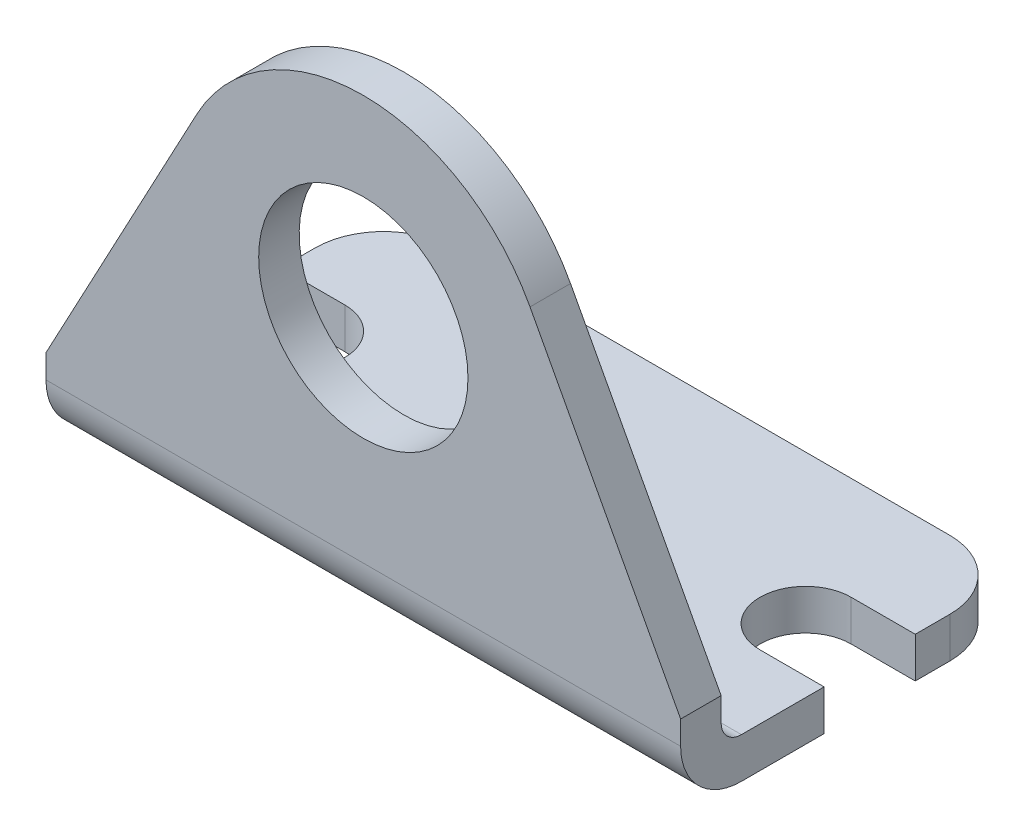
ISO-10303-21;
HEADER;
FILE_DESCRIPTION(('STEP AP214'),'2;1');
FILE_NAME('part.step','',(''),(''),'','','');
FILE_SCHEMA(('AUTOMOTIVE_DESIGN { 1 0 10303 214 1 1 1 1 }'));
ENDSEC;
DATA;
#1=APPLICATION_CONTEXT('core data for automotive mechanical design processes');
#2=APPLICATION_PROTOCOL_DEFINITION('international standard','automotive_design',2000,#1);
#3=PRODUCT_CONTEXT('',#1,'mechanical');
#4=PRODUCT('Part','Part','',(#3));
#5=PRODUCT_RELATED_PRODUCT_CATEGORY('part','',(#4));
#6=PRODUCT_DEFINITION_FORMATION('','',#4);
#7=PRODUCT_DEFINITION_CONTEXT('part definition',#1,'design');
#8=PRODUCT_DEFINITION('design','',#6,#7);
#9=PRODUCT_DEFINITION_SHAPE('','',#8);
#10=(LENGTH_UNIT() NAMED_UNIT(*) SI_UNIT(.MILLI.,.METRE.));
#11=(NAMED_UNIT(*) PLANE_ANGLE_UNIT() SI_UNIT($,.RADIAN.));
#12=(NAMED_UNIT(*) SI_UNIT($,.STERADIAN.) SOLID_ANGLE_UNIT());
#13=UNCERTAINTY_MEASURE_WITH_UNIT(LENGTH_MEASURE(1.E-05),#10,'distance_accuracy_value','');
#14=(GEOMETRIC_REPRESENTATION_CONTEXT(3) GLOBAL_UNCERTAINTY_ASSIGNED_CONTEXT((#13)) GLOBAL_UNIT_ASSIGNED_CONTEXT((#10,
#11,#12)) REPRESENTATION_CONTEXT('',''));
#15=CARTESIAN_POINT('',(0.,0.,0.));
#16=DIRECTION('',(0.,0.,1.));
#17=DIRECTION('',(1.,0.,0.));
#18=AXIS2_PLACEMENT_3D('',#15,#16,#17);
#19=CARTESIAN_POINT('',(-23.876,0.,14.224));
#20=DIRECTION('',(0.,1.,0.));
#21=DIRECTION('',(0.,0.,1.));
#22=AXIS2_PLACEMENT_3D('',#19,#20,#21);
#23=PLANE('',#22);
#24=DIRECTION('',(0.,0.,-1.));
#25=VECTOR('',#24,1.);
#26=CARTESIAN_POINT('',(-23.876,0.,14.224));
#27=LINE('',#26,#25);
#28=CARTESIAN_POINT('',(-23.876,0.,-3.429));
#29=VERTEX_POINT('',#28);
#30=CARTESIAN_POINT('',(-23.876,0.,-6.0325));
#31=VERTEX_POINT('',#30);
#32=EDGE_CURVE('E199',#29,#31,#27,.T.);
#33=ORIENTED_EDGE('',*,*,#32,.T.);
#34=CARTESIAN_POINT('',(-18.7325,0.,-6.0325));
#35=DIRECTION('',(0.,1.,0.));
#36=DIRECTION('',(0.,0.,1.));
#37=AXIS2_PLACEMENT_3D('',#34,#35,#36);
#38=CIRCLE('',#37,5.1435);
#39=CARTESIAN_POINT('',(-18.7325,0.,-11.176));
#40=VERTEX_POINT('',#39);
#41=EDGE_CURVE('E222',#31,#40,#38,.F.);
#42=ORIENTED_EDGE('',*,*,#41,.T.);
#43=DIRECTION('',(1.,0.,0.));
#44=VECTOR('',#43,1.);
#45=CARTESIAN_POINT('',(-23.876,0.,-11.176));
#46=LINE('',#45,#44);
#47=CARTESIAN_POINT('',(18.7325,0.,-11.176));
#48=VERTEX_POINT('',#47);
#49=EDGE_CURVE('E245',#40,#48,#46,.T.);
#50=ORIENTED_EDGE('',*,*,#49,.T.);
#51=CARTESIAN_POINT('',(18.7325,0.,-6.0325));
#52=DIRECTION('',(0.,1.,0.));
#53=DIRECTION('',(0.,0.,1.));
#54=AXIS2_PLACEMENT_3D('',#51,#52,#53);
#55=CIRCLE('',#54,5.1435);
#56=CARTESIAN_POINT('',(23.876,0.,-6.0325));
#57=VERTEX_POINT('',#56);
#58=EDGE_CURVE('E220',#48,#57,#55,.F.);
#59=ORIENTED_EDGE('',*,*,#58,.T.);
#60=DIRECTION('',(0.,0.,-1.));
#61=VECTOR('',#60,1.);
#62=CARTESIAN_POINT('',(23.876,0.,14.224));
#63=LINE('',#62,#61);
#64=CARTESIAN_POINT('',(23.876,0.,-3.429));
#65=VERTEX_POINT('',#64);
#66=EDGE_CURVE('E200',#65,#57,#63,.T.);
#67=ORIENTED_EDGE('',*,*,#66,.F.);
#68=DIRECTION('',(-1.,0.,0.));
#69=VECTOR('',#68,1.);
#70=CARTESIAN_POINT('',(19.05,0.,-3.429));
#71=LINE('',#70,#69);
#72=CARTESIAN_POINT('',(19.05,0.,-3.429));
#73=VERTEX_POINT('',#72);
#74=EDGE_CURVE('E324',#65,#73,#71,.T.);
#75=ORIENTED_EDGE('',*,*,#74,.T.);
#76=CARTESIAN_POINT('',(19.05,0.,0.));
#77=DIRECTION('',(0.,1.,0.));
#78=DIRECTION('',(0.,0.,1.));
#79=AXIS2_PLACEMENT_3D('',#76,#77,#78);
#80=CIRCLE('',#79,3.429);
#81=CARTESIAN_POINT('',(19.05,0.,3.429));
#82=VERTEX_POINT('',#81);
#83=EDGE_CURVE('E321',#73,#82,#80,.T.);
#84=ORIENTED_EDGE('',*,*,#83,.T.);
#85=DIRECTION('',(1.,0.,0.));
#86=VECTOR('',#85,1.);
#87=CARTESIAN_POINT('',(19.05,0.,3.429));
#88=LINE('',#87,#86);
#89=CARTESIAN_POINT('',(23.876,0.,3.429));
#90=VERTEX_POINT('',#89);
#91=EDGE_CURVE('E198',#82,#90,#88,.T.);
#92=ORIENTED_EDGE('',*,*,#91,.T.);
#93=CARTESIAN_POINT('',(23.876,0.,9.652));
#94=VERTEX_POINT('',#93);
#95=EDGE_CURVE('E189',#94,#90,#63,.T.);
#96=ORIENTED_EDGE('',*,*,#95,.F.);
#97=DIRECTION('',(-1.,0.,0.));
#98=VECTOR('',#97,1.);
#99=CARTESIAN_POINT('',(23.876,0.,9.652));
#100=LINE('',#99,#98);
#101=CARTESIAN_POINT('',(-23.876,0.,9.652));
#102=VERTEX_POINT('',#101);
#103=EDGE_CURVE('E172',#94,#102,#100,.T.);
#104=ORIENTED_EDGE('',*,*,#103,.T.);
#105=CARTESIAN_POINT('',(-23.876,0.,3.429));
#106=VERTEX_POINT('',#105);
#107=EDGE_CURVE('E202',#102,#106,#27,.T.);
#108=ORIENTED_EDGE('',*,*,#107,.T.);
#109=DIRECTION('',(1.,0.,0.));
#110=VECTOR('',#109,1.);
#111=CARTESIAN_POINT('',(-19.05,0.,3.429));
#112=LINE('',#111,#110);
#113=CARTESIAN_POINT('',(-19.05,0.,3.429));
#114=VERTEX_POINT('',#113);
#115=EDGE_CURVE('E337',#106,#114,#112,.T.);
#116=ORIENTED_EDGE('',*,*,#115,.T.);
#117=CARTESIAN_POINT('',(-19.05,0.,0.));
#118=DIRECTION('',(0.,1.,0.));
#119=DIRECTION('',(0.,0.,1.));
#120=AXIS2_PLACEMENT_3D('',#117,#118,#119);
#121=CIRCLE('',#120,3.429);
#122=CARTESIAN_POINT('',(-19.05,0.,-3.429));
#123=VERTEX_POINT('',#122);
#124=EDGE_CURVE('E340',#114,#123,#121,.T.);
#125=ORIENTED_EDGE('',*,*,#124,.T.);
#126=DIRECTION('',(-1.,0.,0.));
#127=VECTOR('',#126,1.);
#128=CARTESIAN_POINT('',(-19.05,0.,-3.429));
#129=LINE('',#128,#127);
#130=EDGE_CURVE('E335',#123,#29,#129,.T.);
#131=ORIENTED_EDGE('',*,*,#130,.T.);
#132=EDGE_LOOP('',(#33,#42,#50,#59,#67,#75,#84,#92,#96,#104,#108,#116,#125,#131));
#133=FACE_BOUND('',#132,.T.);
#134=ADVANCED_FACE('F34',(#133),#23,.F.);
#135=CARTESIAN_POINT('',(0.,20.828,14.224));
#136=DIRECTION('',(0.,0.,1.));
#137=DIRECTION('',(1.,0.,0.));
#138=AXIS2_PLACEMENT_3D('',#135,#136,#137);
#139=PLANE('',#138);
#140=CARTESIAN_POINT('',(0.,20.574,14.224));
#141=DIRECTION('',(0.,0.,1.));
#142=DIRECTION('',(1.,0.,0.));
#143=AXIS2_PLACEMENT_3D('',#140,#141,#142);
#144=CIRCLE('',#143,7.874);
#145=CARTESIAN_POINT('',(7.874,20.574,14.224));
#146=VERTEX_POINT('',#145);
#147=EDGE_CURVE('E249',#146,#146,#144,.T.);
#148=ORIENTED_EDGE('',*,*,#147,.F.);
#149=EDGE_LOOP('',(#148));
#150=FACE_BOUND('',#149,.T.);
#151=DIRECTION('',(0.,-1.,0.));
#152=VECTOR('',#151,1.);
#153=CARTESIAN_POINT('',(-23.876,6.35,14.224));
#154=LINE('',#153,#152);
#155=CARTESIAN_POINT('',(-23.876,6.35,14.224));
#156=VERTEX_POINT('',#155);
#157=CARTESIAN_POINT('',(-23.876,4.572,14.224));
#158=VERTEX_POINT('',#157);
#159=EDGE_CURVE('E252',#156,#158,#154,.T.);
#160=ORIENTED_EDGE('',*,*,#159,.T.);
#161=DIRECTION('',(-1.,0.,0.));
#162=VECTOR('',#161,1.);
#163=CARTESIAN_POINT('',(23.876,4.572,14.224));
#164=LINE('',#163,#162);
#165=CARTESIAN_POINT('',(23.876,4.572,14.224));
#166=VERTEX_POINT('',#165);
#167=EDGE_CURVE('E183',#166,#158,#164,.T.);
#168=ORIENTED_EDGE('',*,*,#167,.F.);
#169=DIRECTION('',(0.,1.,0.));
#170=VECTOR('',#169,1.);
#171=CARTESIAN_POINT('',(23.876,0.,14.224));
#172=LINE('',#171,#170);
#173=CARTESIAN_POINT('',(23.876,6.35,14.224));
#174=VERTEX_POINT('',#173);
#175=EDGE_CURVE('E192',#166,#174,#172,.T.);
#176=ORIENTED_EDGE('',*,*,#175,.T.);
#177=DIRECTION('',(-0.471685602568826,0.881766801557693,0.));
#178=VECTOR('',#177,1.);
#179=CARTESIAN_POINT('',(23.876,6.35,14.224));
#180=LINE('',#179,#178);
#181=CARTESIAN_POINT('',(12.5422509853566,27.537256010939,14.224));
#182=VERTEX_POINT('',#181);
#183=EDGE_CURVE('E261',#174,#182,#180,.T.);
#184=ORIENTED_EDGE('',*,*,#183,.T.);
#185=CARTESIAN_POINT('',(0.,20.828,14.224));
#186=DIRECTION('',(0.,0.,1.));
#187=DIRECTION('',(1.,0.,0.));
#188=AXIS2_PLACEMENT_3D('',#185,#186,#187);
#189=CIRCLE('',#188,14.224);
#190=CARTESIAN_POINT('',(-12.5422509853566,27.537256010939,14.224));
#191=VERTEX_POINT('',#190);
#192=EDGE_CURVE('E263',#182,#191,#189,.T.);
#193=ORIENTED_EDGE('',*,*,#192,.T.);
#194=DIRECTION('',(-0.471685602568826,-0.881766801557693,0.));
#195=VECTOR('',#194,1.);
#196=CARTESIAN_POINT('',(-12.5422509853566,27.537256010939,14.224));
#197=LINE('',#196,#195);
#198=EDGE_CURVE('E265',#191,#156,#197,.T.);
#199=ORIENTED_EDGE('',*,*,#198,.T.);
#200=EDGE_LOOP('',(#160,#168,#176,#184,#193,#199));
#201=FACE_BOUND('',#200,.T.);
#202=ADVANCED_FACE('F378',(#150,#201),#139,.T.);
#203=CARTESIAN_POINT('',(23.876,0.,14.224));
#204=DIRECTION('',(-1.,0.,0.));
#205=DIRECTION('',(0.,0.,1.));
#206=AXIS2_PLACEMENT_3D('',#203,#204,#205);
#207=PLANE('',#206);
#208=ORIENTED_EDGE('',*,*,#175,.F.);
#209=CARTESIAN_POINT('',(23.876,4.572,9.652));
#210=DIRECTION('',(1.,0.,0.));
#211=DIRECTION('',(0.,0.,1.));
#212=AXIS2_PLACEMENT_3D('',#209,#210,#211);
#213=CIRCLE('',#212,4.572);
#214=EDGE_CURVE('E175',#166,#94,#213,.T.);
#215=ORIENTED_EDGE('',*,*,#214,.T.);
#216=ORIENTED_EDGE('',*,*,#95,.T.);
#217=DIRECTION('',(0.,-1.,0.));
#218=VECTOR('',#217,1.);
#219=CARTESIAN_POINT('',(23.876,35.052,3.429));
#220=LINE('',#219,#218);
#221=CARTESIAN_POINT('',(23.876,3.048,3.429));
#222=VERTEX_POINT('',#221);
#223=EDGE_CURVE('E331',#222,#90,#220,.T.);
#224=ORIENTED_EDGE('',*,*,#223,.F.);
#225=DIRECTION('',(0.,0.,1.));
#226=VECTOR('',#225,1.);
#227=CARTESIAN_POINT('',(23.876,3.048,-11.176));
#228=LINE('',#227,#226);
#229=CARTESIAN_POINT('',(23.876,3.048,9.652));
#230=VERTEX_POINT('',#229);
#231=EDGE_CURVE('E302',#222,#230,#228,.T.);
#232=ORIENTED_EDGE('',*,*,#231,.T.);
#233=CARTESIAN_POINT('',(23.876,4.572,9.652));
#234=DIRECTION('',(-1.,0.,0.));
#235=DIRECTION('',(0.,0.,1.));
#236=AXIS2_PLACEMENT_3D('',#233,#234,#235);
#237=CIRCLE('',#236,1.524);
#238=CARTESIAN_POINT('',(23.876,4.572,11.176));
#239=VERTEX_POINT('',#238);
#240=EDGE_CURVE('E289',#230,#239,#237,.T.);
#241=ORIENTED_EDGE('',*,*,#240,.T.);
#242=DIRECTION('',(0.,1.,0.));
#243=VECTOR('',#242,1.);
#244=CARTESIAN_POINT('',(23.876,35.052,11.176));
#245=LINE('',#244,#243);
#246=CARTESIAN_POINT('',(23.876,6.34999999999999,11.176));
#247=VERTEX_POINT('',#246);
#248=EDGE_CURVE('E286',#239,#247,#245,.T.);
#249=ORIENTED_EDGE('',*,*,#248,.T.);
#250=DIRECTION('',(0.,0.,-1.));
#251=VECTOR('',#250,1.);
#252=CARTESIAN_POINT('',(23.876,6.35,14.224));
#253=LINE('',#252,#251);
#254=EDGE_CURVE('E205',#174,#247,#253,.T.);
#255=ORIENTED_EDGE('',*,*,#254,.F.);
#256=EDGE_LOOP('',(#208,#215,#216,#224,#232,#241,#249,#255));
#257=FACE_BOUND('',#256,.T.);
#258=ADVANCED_FACE('F187',(#257),#207,.F.);
#259=ORIENTED_EDGE('',*,*,#66,.T.);
#260=DIRECTION('',(0.,1.,0.));
#261=VECTOR('',#260,1.);
#262=CARTESIAN_POINT('',(23.876,0.,-6.0325));
#263=LINE('',#262,#261);
#264=CARTESIAN_POINT('',(23.876,3.048,-6.0325));
#265=VERTEX_POINT('',#264);
#266=EDGE_CURVE('E11',#57,#265,#263,.T.);
#267=ORIENTED_EDGE('',*,*,#266,.T.);
#268=CARTESIAN_POINT('',(23.876,3.048,-3.429));
#269=VERTEX_POINT('',#268);
#270=EDGE_CURVE('E294',#265,#269,#228,.T.);
#271=ORIENTED_EDGE('',*,*,#270,.T.);
#272=DIRECTION('',(0.,-1.,0.));
#273=VECTOR('',#272,1.);
#274=CARTESIAN_POINT('',(23.876,35.052,-3.429));
#275=LINE('',#274,#273);
#276=EDGE_CURVE('E329',#269,#65,#275,.T.);
#277=ORIENTED_EDGE('',*,*,#276,.T.);
#278=EDGE_LOOP('',(#259,#267,#271,#277));
#279=FACE_BOUND('',#278,.T.);
#280=ADVANCED_FACE('F398',(#279),#207,.F.);
#281=CARTESIAN_POINT('',(23.876,6.35,14.224));
#282=DIRECTION('',(-0.881766801557693,-0.471685602568826,0.));
#283=DIRECTION('',(0.471685602568826,-0.881766801557693,0.));
#284=AXIS2_PLACEMENT_3D('',#281,#282,#283);
#285=PLANE('',#284);
#286=ORIENTED_EDGE('',*,*,#254,.T.);
#287=DIRECTION('',(-0.471685602568826,0.881766801557693,0.));
#288=VECTOR('',#287,1.);
#289=CARTESIAN_POINT('',(23.876,6.35,11.176));
#290=LINE('',#289,#288);
#291=CARTESIAN_POINT('',(12.5422509853566,27.537256010939,11.176));
#292=VERTEX_POINT('',#291);
#293=EDGE_CURVE('E282',#247,#292,#290,.T.);
#294=ORIENTED_EDGE('',*,*,#293,.T.);
#295=DIRECTION('',(0.,0.,-1.));
#296=VECTOR('',#295,1.);
#297=CARTESIAN_POINT('',(12.5422509853566,27.537256010939,14.224));
#298=LINE('',#297,#296);
#299=EDGE_CURVE('E272',#182,#292,#298,.T.);
#300=ORIENTED_EDGE('',*,*,#299,.F.);
#301=ORIENTED_EDGE('',*,*,#183,.F.);
#302=EDGE_LOOP('',(#286,#294,#300,#301));
#303=FACE_BOUND('',#302,.T.);
#304=ADVANCED_FACE('F281',(#303),#285,.F.);
#305=CARTESIAN_POINT('',(-23.876,6.35,14.224));
#306=DIRECTION('',(1.,0.,0.));
#307=DIRECTION('',(0.,0.,-1.));
#308=AXIS2_PLACEMENT_3D('',#305,#306,#307);
#309=PLANE('',#308);
#310=DIRECTION('',(0.,0.,1.));
#311=VECTOR('',#310,1.);
#312=CARTESIAN_POINT('',(-23.876,3.048,-11.176));
#313=LINE('',#312,#311);
#314=CARTESIAN_POINT('',(-23.876,3.048,-6.0325));
#315=VERTEX_POINT('',#314);
#316=CARTESIAN_POINT('',(-23.876,3.048,-3.429));
#317=VERTEX_POINT('',#316);
#318=EDGE_CURVE('E231',#315,#317,#313,.T.);
#319=ORIENTED_EDGE('',*,*,#318,.F.);
#320=DIRECTION('',(0.,-1.,0.));
#321=VECTOR('',#320,1.);
#322=CARTESIAN_POINT('',(-23.876,6.35,-6.0325));
#323=LINE('',#322,#321);
#324=EDGE_CURVE('E212',#315,#31,#323,.T.);
#325=ORIENTED_EDGE('',*,*,#324,.T.);
#326=ORIENTED_EDGE('',*,*,#32,.F.);
#327=DIRECTION('',(0.,-1.,0.));
#328=VECTOR('',#327,1.);
#329=CARTESIAN_POINT('',(-23.876,35.052,-3.429));
#330=LINE('',#329,#328);
#331=EDGE_CURVE('E240',#317,#29,#330,.T.);
#332=ORIENTED_EDGE('',*,*,#331,.F.);
#333=EDGE_LOOP('',(#319,#325,#326,#332));
#334=FACE_BOUND('',#333,.T.);
#335=ADVANCED_FACE('F238',(#334),#309,.F.);
#336=ORIENTED_EDGE('',*,*,#107,.F.);
#337=CARTESIAN_POINT('',(-23.876,4.572,9.652));
#338=DIRECTION('',(1.,0.,0.));
#339=DIRECTION('',(0.,0.,1.));
#340=AXIS2_PLACEMENT_3D('',#337,#338,#339);
#341=CIRCLE('',#340,4.572);
#342=EDGE_CURVE('E178',#158,#102,#341,.T.);
#343=ORIENTED_EDGE('',*,*,#342,.F.);
#344=ORIENTED_EDGE('',*,*,#159,.F.);
#345=DIRECTION('',(0.,0.,-1.));
#346=VECTOR('',#345,1.);
#347=CARTESIAN_POINT('',(-23.876,6.35,14.224));
#348=LINE('',#347,#346);
#349=CARTESIAN_POINT('',(-23.876,6.35,11.176));
#350=VERTEX_POINT('',#349);
#351=EDGE_CURVE('E267',#156,#350,#348,.T.);
#352=ORIENTED_EDGE('',*,*,#351,.T.);
#353=DIRECTION('',(0.,1.,0.));
#354=VECTOR('',#353,1.);
#355=CARTESIAN_POINT('',(-23.876,35.052,11.176));
#356=LINE('',#355,#354);
#357=CARTESIAN_POINT('',(-23.876,4.572,11.176));
#358=VERTEX_POINT('',#357);
#359=EDGE_CURVE('E300',#358,#350,#356,.T.);
#360=ORIENTED_EDGE('',*,*,#359,.F.);
#361=CARTESIAN_POINT('',(-23.876,4.572,9.652));
#362=DIRECTION('',(-1.,0.,0.));
#363=DIRECTION('',(0.,0.,1.));
#364=AXIS2_PLACEMENT_3D('',#361,#362,#363);
#365=CIRCLE('',#364,1.524);
#366=CARTESIAN_POINT('',(-23.876,3.048,9.652));
#367=VERTEX_POINT('',#366);
#368=EDGE_CURVE('E241',#367,#358,#365,.T.);
#369=ORIENTED_EDGE('',*,*,#368,.F.);
#370=CARTESIAN_POINT('',(-23.876,3.048,3.429));
#371=VERTEX_POINT('',#370);
#372=EDGE_CURVE('E182',#371,#367,#313,.T.);
#373=ORIENTED_EDGE('',*,*,#372,.F.);
#374=DIRECTION('',(0.,-1.,0.));
#375=VECTOR('',#374,1.);
#376=CARTESIAN_POINT('',(-23.876,35.052,3.429));
#377=LINE('',#376,#375);
#378=EDGE_CURVE('E254',#371,#106,#377,.T.);
#379=ORIENTED_EDGE('',*,*,#378,.T.);
#380=EDGE_LOOP('',(#336,#343,#344,#352,#360,#369,#373,#379));
#381=FACE_BOUND('',#380,.T.);
#382=ADVANCED_FACE('F351',(#381),#309,.F.);
#383=CARTESIAN_POINT('',(-12.5422509853566,27.537256010939,14.224));
#384=DIRECTION('',(0.881766801557693,-0.471685602568826,0.));
#385=DIRECTION('',(0.471685602568826,0.881766801557693,0.));
#386=AXIS2_PLACEMENT_3D('',#383,#384,#385);
#387=PLANE('',#386);
#388=DIRECTION('',(0.,0.,-1.));
#389=VECTOR('',#388,1.);
#390=CARTESIAN_POINT('',(-12.5422509853566,27.537256010939,14.224));
#391=LINE('',#390,#389);
#392=CARTESIAN_POINT('',(-12.5422509853566,27.537256010939,11.176));
#393=VERTEX_POINT('',#392);
#394=EDGE_CURVE('E270',#191,#393,#391,.T.);
#395=ORIENTED_EDGE('',*,*,#394,.T.);
#396=DIRECTION('',(-0.471685602568826,-0.881766801557693,0.));
#397=VECTOR('',#396,1.);
#398=CARTESIAN_POINT('',(-12.5422509853566,27.537256010939,11.176));
#399=LINE('',#398,#397);
#400=EDGE_CURVE('E317',#393,#350,#399,.T.);
#401=ORIENTED_EDGE('',*,*,#400,.T.);
#402=ORIENTED_EDGE('',*,*,#351,.F.);
#403=ORIENTED_EDGE('',*,*,#198,.F.);
#404=EDGE_LOOP('',(#395,#401,#402,#403));
#405=FACE_BOUND('',#404,.T.);
#406=ADVANCED_FACE('F373',(#405),#387,.F.);
#407=CARTESIAN_POINT('',(0.,20.828,14.224));
#408=DIRECTION('',(0.,0.,-1.));
#409=DIRECTION('',(-1.,0.,0.));
#410=AXIS2_PLACEMENT_3D('',#407,#408,#409);
#411=CYLINDRICAL_SURFACE('',#410,14.224);
#412=CARTESIAN_POINT('',(0.,20.828,11.176));
#413=DIRECTION('',(0.,0.,1.));
#414=DIRECTION('',(0.,-1.,0.));
#415=AXIS2_PLACEMENT_3D('',#412,#413,#414);
#416=CIRCLE('',#415,14.224);
#417=EDGE_CURVE('E216',#292,#393,#416,.T.);
#418=ORIENTED_EDGE('',*,*,#417,.T.);
#419=ORIENTED_EDGE('',*,*,#394,.F.);
#420=ORIENTED_EDGE('',*,*,#192,.F.);
#421=ORIENTED_EDGE('',*,*,#299,.T.);
#422=EDGE_LOOP('',(#418,#419,#420,#421));
#423=FACE_BOUND('',#422,.T.);
#424=ADVANCED_FACE('F376',(#423),#411,.T.);
#425=CARTESIAN_POINT('',(0.,20.574,14.224));
#426=DIRECTION('',(0.,0.,-1.));
#427=DIRECTION('',(-1.,0.,0.));
#428=AXIS2_PLACEMENT_3D('',#425,#426,#427);
#429=CYLINDRICAL_SURFACE('',#428,7.874);
#430=CARTESIAN_POINT('',(0.,20.574,11.176));
#431=DIRECTION('',(0.,0.,1.));
#432=DIRECTION('',(0.,-1.,0.));
#433=AXIS2_PLACEMENT_3D('',#430,#431,#432);
#434=CIRCLE('',#433,7.874);
#435=CARTESIAN_POINT('',(0.,12.7,11.176));
#436=VERTEX_POINT('',#435);
#437=EDGE_CURVE('E213',#436,#436,#434,.T.);
#438=ORIENTED_EDGE('',*,*,#437,.F.);
#439=EDGE_LOOP('',(#438));
#440=FACE_BOUND('',#439,.T.);
#441=ORIENTED_EDGE('',*,*,#147,.T.);
#442=EDGE_LOOP('',(#441));
#443=FACE_BOUND('',#442,.T.);
#444=ADVANCED_FACE('F424',(#440,#443),#429,.F.);
#445=CARTESIAN_POINT('',(0.,20.828,-11.176));
#446=DIRECTION('',(0.,0.,1.));
#447=DIRECTION('',(1.,0.,0.));
#448=AXIS2_PLACEMENT_3D('',#445,#446,#447);
#449=PLANE('',#448);
#450=ORIENTED_EDGE('',*,*,#49,.F.);
#451=DIRECTION('',(0.,-1.,0.));
#452=VECTOR('',#451,1.);
#453=CARTESIAN_POINT('',(-18.7325,20.828,-11.176));
#454=LINE('',#453,#452);
#455=CARTESIAN_POINT('',(-18.7325,3.048,-11.176));
#456=VERTEX_POINT('',#455);
#457=EDGE_CURVE('E56',#40,#456,#454,.F.);
#458=ORIENTED_EDGE('',*,*,#457,.T.);
#459=DIRECTION('',(-1.,0.,0.));
#460=VECTOR('',#459,1.);
#461=CARTESIAN_POINT('',(23.876,3.048,-11.176));
#462=LINE('',#461,#460);
#463=CARTESIAN_POINT('',(18.7325,3.048,-11.176));
#464=VERTEX_POINT('',#463);
#465=EDGE_CURVE('E233',#464,#456,#462,.T.);
#466=ORIENTED_EDGE('',*,*,#465,.F.);
#467=DIRECTION('',(0.,1.,0.));
#468=VECTOR('',#467,1.);
#469=CARTESIAN_POINT('',(18.7325,20.828,-11.176));
#470=LINE('',#469,#468);
#471=EDGE_CURVE('E224',#464,#48,#470,.F.);
#472=ORIENTED_EDGE('',*,*,#471,.T.);
#473=EDGE_LOOP('',(#450,#458,#466,#472));
#474=FACE_BOUND('',#473,.T.);
#475=ADVANCED_FACE('F248',(#474),#449,.F.);
#476=CARTESIAN_POINT('',(-19.05,35.052,-3.429));
#477=DIRECTION('',(0.,0.,1.));
#478=DIRECTION('',(1.,0.,0.));
#479=AXIS2_PLACEMENT_3D('',#476,#477,#478);
#480=PLANE('',#479);
#481=DIRECTION('',(1.,0.,0.));
#482=VECTOR('',#481,1.);
#483=CARTESIAN_POINT('',(-19.05,3.048,-3.429));
#484=LINE('',#483,#482);
#485=CARTESIAN_POINT('',(-19.05,3.048,-3.429));
#486=VERTEX_POINT('',#485);
#487=EDGE_CURVE('E217',#317,#486,#484,.T.);
#488=ORIENTED_EDGE('',*,*,#487,.F.);
#489=ORIENTED_EDGE('',*,*,#331,.T.);
#490=ORIENTED_EDGE('',*,*,#130,.F.);
#491=DIRECTION('',(0.,-1.,0.));
#492=VECTOR('',#491,1.);
#493=CARTESIAN_POINT('',(-19.05,35.052,-3.429));
#494=LINE('',#493,#492);
#495=EDGE_CURVE('E343',#486,#123,#494,.T.);
#496=ORIENTED_EDGE('',*,*,#495,.F.);
#497=EDGE_LOOP('',(#488,#489,#490,#496));
#498=FACE_BOUND('',#497,.T.);
#499=ADVANCED_FACE('F364',(#498),#480,.T.);
#500=CARTESIAN_POINT('',(-19.05,35.052,3.429));
#501=DIRECTION('',(0.,0.,-1.));
#502=DIRECTION('',(-1.,0.,0.));
#503=AXIS2_PLACEMENT_3D('',#500,#501,#502);
#504=PLANE('',#503);
#505=DIRECTION('',(-1.,0.,0.));
#506=VECTOR('',#505,1.);
#507=CARTESIAN_POINT('',(-19.05,3.048,3.429));
#508=LINE('',#507,#506);
#509=CARTESIAN_POINT('',(-19.05,3.048,3.429));
#510=VERTEX_POINT('',#509);
#511=EDGE_CURVE('E313',#510,#371,#508,.T.);
#512=ORIENTED_EDGE('',*,*,#511,.F.);
#513=DIRECTION('',(0.,-1.,0.));
#514=VECTOR('',#513,1.);
#515=CARTESIAN_POINT('',(-19.05,35.052,3.429));
#516=LINE('',#515,#514);
#517=EDGE_CURVE('E345',#510,#114,#516,.T.);
#518=ORIENTED_EDGE('',*,*,#517,.T.);
#519=ORIENTED_EDGE('',*,*,#115,.F.);
#520=ORIENTED_EDGE('',*,*,#378,.F.);
#521=EDGE_LOOP('',(#512,#518,#519,#520));
#522=FACE_BOUND('',#521,.T.);
#523=ADVANCED_FACE('F355',(#522),#504,.T.);
#524=CARTESIAN_POINT('',(-19.05,35.052,0.));
#525=DIRECTION('',(0.,-1.,0.));
#526=DIRECTION('',(0.,0.,-1.));
#527=AXIS2_PLACEMENT_3D('',#524,#525,#526);
#528=CYLINDRICAL_SURFACE('',#527,3.429);
#529=CARTESIAN_POINT('',(-19.05,3.048,0.));
#530=DIRECTION('',(0.,-1.,0.));
#531=DIRECTION('',(0.,0.,-1.));
#532=AXIS2_PLACEMENT_3D('',#529,#530,#531);
#533=CIRCLE('',#532,3.429);
#534=EDGE_CURVE('E311',#486,#510,#533,.T.);
#535=ORIENTED_EDGE('',*,*,#534,.F.);
#536=ORIENTED_EDGE('',*,*,#495,.T.);
#537=ORIENTED_EDGE('',*,*,#124,.F.);
#538=ORIENTED_EDGE('',*,*,#517,.F.);
#539=EDGE_LOOP('',(#535,#536,#537,#538));
#540=FACE_BOUND('',#539,.T.);
#541=ADVANCED_FACE('F361',(#540),#528,.F.);
#542=CARTESIAN_POINT('',(19.05,35.052,0.));
#543=DIRECTION('',(0.,-1.,0.));
#544=DIRECTION('',(0.,0.,-1.));
#545=AXIS2_PLACEMENT_3D('',#542,#543,#544);
#546=CYLINDRICAL_SURFACE('',#545,3.429);
#547=CARTESIAN_POINT('',(19.05,3.048,0.));
#548=DIRECTION('',(0.,-1.,0.));
#549=DIRECTION('',(0.,0.,-1.));
#550=AXIS2_PLACEMENT_3D('',#547,#548,#549);
#551=CIRCLE('',#550,3.429);
#552=CARTESIAN_POINT('',(19.05,3.048,3.429));
#553=VERTEX_POINT('',#552);
#554=CARTESIAN_POINT('',(19.05,3.048,-3.429));
#555=VERTEX_POINT('',#554);
#556=EDGE_CURVE('E305',#553,#555,#551,.T.);
#557=ORIENTED_EDGE('',*,*,#556,.F.);
#558=DIRECTION('',(0.,-1.,0.));
#559=VECTOR('',#558,1.);
#560=CARTESIAN_POINT('',(19.05,35.052,3.429));
#561=LINE('',#560,#559);
#562=EDGE_CURVE('E333',#553,#82,#561,.T.);
#563=ORIENTED_EDGE('',*,*,#562,.T.);
#564=ORIENTED_EDGE('',*,*,#83,.F.);
#565=DIRECTION('',(0.,-1.,0.));
#566=VECTOR('',#565,1.);
#567=CARTESIAN_POINT('',(19.05,35.052,-3.429));
#568=LINE('',#567,#566);
#569=EDGE_CURVE('E327',#555,#73,#568,.T.);
#570=ORIENTED_EDGE('',*,*,#569,.F.);
#571=EDGE_LOOP('',(#557,#563,#564,#570));
#572=FACE_BOUND('',#571,.T.);
#573=ADVANCED_FACE('F390',(#572),#546,.F.);
#574=CARTESIAN_POINT('',(19.05,35.052,3.429));
#575=DIRECTION('',(0.,0.,-1.));
#576=DIRECTION('',(-1.,0.,0.));
#577=AXIS2_PLACEMENT_3D('',#574,#575,#576);
#578=PLANE('',#577);
#579=DIRECTION('',(-1.,0.,0.));
#580=VECTOR('',#579,1.);
#581=CARTESIAN_POINT('',(19.05,3.048,3.429));
#582=LINE('',#581,#580);
#583=EDGE_CURVE('E309',#222,#553,#582,.T.);
#584=ORIENTED_EDGE('',*,*,#583,.F.);
#585=ORIENTED_EDGE('',*,*,#223,.T.);
#586=ORIENTED_EDGE('',*,*,#91,.F.);
#587=ORIENTED_EDGE('',*,*,#562,.F.);
#588=EDGE_LOOP('',(#584,#585,#586,#587));
#589=FACE_BOUND('',#588,.T.);
#590=ADVANCED_FACE('F387',(#589),#578,.T.);
#591=CARTESIAN_POINT('',(19.05,35.052,-3.429));
#592=DIRECTION('',(0.,0.,1.));
#593=DIRECTION('',(1.,0.,0.));
#594=AXIS2_PLACEMENT_3D('',#591,#592,#593);
#595=PLANE('',#594);
#596=DIRECTION('',(1.,0.,0.));
#597=VECTOR('',#596,1.);
#598=CARTESIAN_POINT('',(19.05,3.048,-3.429));
#599=LINE('',#598,#597);
#600=EDGE_CURVE('E209',#555,#269,#599,.T.);
#601=ORIENTED_EDGE('',*,*,#600,.F.);
#602=ORIENTED_EDGE('',*,*,#569,.T.);
#603=ORIENTED_EDGE('',*,*,#74,.F.);
#604=ORIENTED_EDGE('',*,*,#276,.F.);
#605=EDGE_LOOP('',(#601,#602,#603,#604));
#606=FACE_BOUND('',#605,.T.);
#607=ADVANCED_FACE('F395',(#606),#595,.T.);
#608=CARTESIAN_POINT('',(23.876,35.052,11.176));
#609=DIRECTION('',(0.,0.,1.));
#610=DIRECTION('',(0.,-1.,0.));
#611=AXIS2_PLACEMENT_3D('',#608,#609,#610);
#612=PLANE('',#611);
#613=ORIENTED_EDGE('',*,*,#437,.T.);
#614=EDGE_LOOP('',(#613));
#615=FACE_BOUND('',#614,.T.);
#616=ORIENTED_EDGE('',*,*,#248,.F.);
#617=DIRECTION('',(-1.,0.,0.));
#618=VECTOR('',#617,1.);
#619=CARTESIAN_POINT('',(23.876,4.572,11.176));
#620=LINE('',#619,#618);
#621=EDGE_CURVE('E303',#239,#358,#620,.T.);
#622=ORIENTED_EDGE('',*,*,#621,.T.);
#623=ORIENTED_EDGE('',*,*,#359,.T.);
#624=ORIENTED_EDGE('',*,*,#400,.F.);
#625=ORIENTED_EDGE('',*,*,#417,.F.);
#626=ORIENTED_EDGE('',*,*,#293,.F.);
#627=EDGE_LOOP('',(#616,#622,#623,#624,#625,#626));
#628=FACE_BOUND('',#627,.T.);
#629=ADVANCED_FACE('F371',(#615,#628),#612,.F.);
#630=CARTESIAN_POINT('',(23.876,4.572,9.652));
#631=DIRECTION('',(-1.,0.,0.));
#632=DIRECTION('',(0.,0.,1.));
#633=AXIS2_PLACEMENT_3D('',#630,#631,#632);
#634=CYLINDRICAL_SURFACE('',#633,1.524);
#635=ORIENTED_EDGE('',*,*,#368,.T.);
#636=ORIENTED_EDGE('',*,*,#621,.F.);
#637=ORIENTED_EDGE('',*,*,#240,.F.);
#638=DIRECTION('',(-1.,0.,0.));
#639=VECTOR('',#638,1.);
#640=CARTESIAN_POINT('',(23.876,3.048,9.652));
#641=LINE('',#640,#639);
#642=EDGE_CURVE('E292',#230,#367,#641,.T.);
#643=ORIENTED_EDGE('',*,*,#642,.T.);
#644=EDGE_LOOP('',(#635,#636,#637,#643));
#645=FACE_BOUND('',#644,.T.);
#646=ADVANCED_FACE('F366',(#645),#634,.F.);
#647=CARTESIAN_POINT('',(23.876,3.048,-11.176));
#648=DIRECTION('',(0.,-1.,0.));
#649=DIRECTION('',(0.,0.,-1.));
#650=AXIS2_PLACEMENT_3D('',#647,#648,#649);
#651=PLANE('',#650);
#652=ORIENTED_EDGE('',*,*,#465,.T.);
#653=CARTESIAN_POINT('',(-18.7325,3.048,-6.0325));
#654=DIRECTION('',(0.,-1.,0.));
#655=DIRECTION('',(0.,0.,-1.));
#656=AXIS2_PLACEMENT_3D('',#653,#654,#655);
#657=CIRCLE('',#656,5.1435);
#658=EDGE_CURVE('E42',#456,#315,#657,.F.);
#659=ORIENTED_EDGE('',*,*,#658,.T.);
#660=ORIENTED_EDGE('',*,*,#318,.T.);
#661=ORIENTED_EDGE('',*,*,#487,.T.);
#662=ORIENTED_EDGE('',*,*,#534,.T.);
#663=ORIENTED_EDGE('',*,*,#511,.T.);
#664=ORIENTED_EDGE('',*,*,#372,.T.);
#665=ORIENTED_EDGE('',*,*,#642,.F.);
#666=ORIENTED_EDGE('',*,*,#231,.F.);
#667=ORIENTED_EDGE('',*,*,#583,.T.);
#668=ORIENTED_EDGE('',*,*,#556,.T.);
#669=ORIENTED_EDGE('',*,*,#600,.T.);
#670=ORIENTED_EDGE('',*,*,#270,.F.);
#671=CARTESIAN_POINT('',(18.7325,3.048,-6.0325));
#672=DIRECTION('',(0.,-1.,0.));
#673=DIRECTION('',(0.,0.,-1.));
#674=AXIS2_PLACEMENT_3D('',#671,#672,#673);
#675=CIRCLE('',#674,5.1435);
#676=EDGE_CURVE('E49',#265,#464,#675,.F.);
#677=ORIENTED_EDGE('',*,*,#676,.T.);
#678=EDGE_LOOP('',(#652,#659,#660,#661,#662,#663,#664,#665,#666,#667,#668,#669,#670,#677));
#679=FACE_BOUND('',#678,.T.);
#680=ADVANCED_FACE('F230',(#679),#651,.F.);
#681=CARTESIAN_POINT('',(23.876,4.572,9.652));
#682=DIRECTION('',(-1.,0.,0.));
#683=DIRECTION('',(0.,0.,1.));
#684=AXIS2_PLACEMENT_3D('',#681,#682,#683);
#685=CYLINDRICAL_SURFACE('',#684,4.572);
#686=ORIENTED_EDGE('',*,*,#342,.T.);
#687=ORIENTED_EDGE('',*,*,#103,.F.);
#688=ORIENTED_EDGE('',*,*,#214,.F.);
#689=ORIENTED_EDGE('',*,*,#167,.T.);
#690=EDGE_LOOP('',(#686,#687,#688,#689));
#691=FACE_BOUND('',#690,.T.);
#692=ADVANCED_FACE('F174',(#691),#685,.T.);
#693=CARTESIAN_POINT('',(-18.7325,6.35,-6.0325));
#694=DIRECTION('',(0.,-1.,0.));
#695=DIRECTION('',(0.,0.,-1.));
#696=AXIS2_PLACEMENT_3D('',#693,#694,#695);
#697=CYLINDRICAL_SURFACE('',#696,5.1435);
#698=ORIENTED_EDGE('',*,*,#658,.F.);
#699=ORIENTED_EDGE('',*,*,#457,.F.);
#700=ORIENTED_EDGE('',*,*,#41,.F.);
#701=ORIENTED_EDGE('',*,*,#324,.F.);
#702=EDGE_LOOP('',(#698,#699,#700,#701));
#703=FACE_BOUND('',#702,.T.);
#704=ADVANCED_FACE('F243',(#703),#697,.T.);
#705=CARTESIAN_POINT('',(18.7325,0.,-6.0325));
#706=DIRECTION('',(0.,1.,0.));
#707=DIRECTION('',(0.,0.,1.));
#708=AXIS2_PLACEMENT_3D('',#705,#706,#707);
#709=CYLINDRICAL_SURFACE('',#708,5.1435);
#710=ORIENTED_EDGE('',*,*,#58,.F.);
#711=ORIENTED_EDGE('',*,*,#471,.F.);
#712=ORIENTED_EDGE('',*,*,#676,.F.);
#713=ORIENTED_EDGE('',*,*,#266,.F.);
#714=EDGE_LOOP('',(#710,#711,#712,#713));
#715=FACE_BOUND('',#714,.T.);
#716=ADVANCED_FACE('F36',(#715),#709,.T.);
#717=CLOSED_SHELL('',(#134,#202,#258,#280,#304,#335,#382,#406,#424,#444,#475,#499,#523,#541,
#573,#590,#607,#629,#646,#680,#692,#704,#716));
#718=MANIFOLD_SOLID_BREP('B2',#717);
#719=ADVANCED_BREP_SHAPE_REPRESENTATION('',(#18,#718),#14);
#720=SHAPE_DEFINITION_REPRESENTATION(#9,#719);
ENDSEC;
END-ISO-10303-21;
